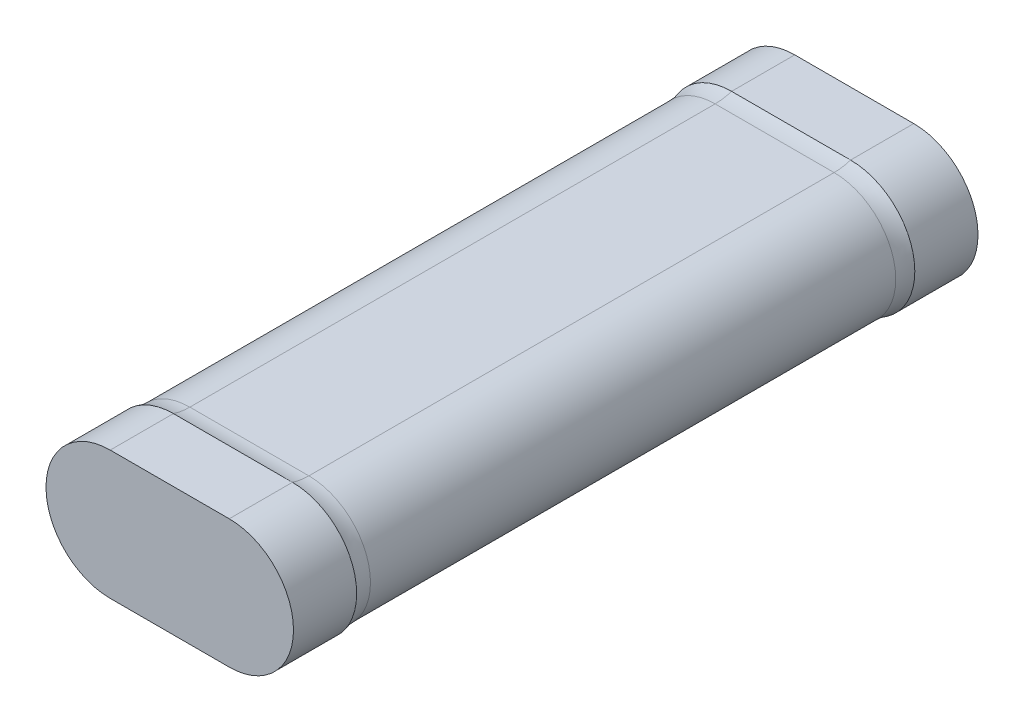
ISO-10303-21;
HEADER;
FILE_DESCRIPTION(('STEP AP214'),'2;1');
FILE_NAME('part.step','',(''),(''),'','','');
FILE_SCHEMA(('AUTOMOTIVE_DESIGN { 1 0 10303 214 1 1 1 1 }'));
ENDSEC;
DATA;
#1=APPLICATION_CONTEXT('core data for automotive mechanical design processes');
#2=APPLICATION_PROTOCOL_DEFINITION('international standard','automotive_design',2000,#1);
#3=PRODUCT_CONTEXT('',#1,'mechanical');
#4=PRODUCT('Part','Part','',(#3));
#5=PRODUCT_RELATED_PRODUCT_CATEGORY('part','',(#4));
#6=PRODUCT_DEFINITION_FORMATION('','',#4);
#7=PRODUCT_DEFINITION_CONTEXT('part definition',#1,'design');
#8=PRODUCT_DEFINITION('design','',#6,#7);
#9=PRODUCT_DEFINITION_SHAPE('','',#8);
#10=(LENGTH_UNIT() NAMED_UNIT(*) SI_UNIT(.MILLI.,.METRE.));
#11=(NAMED_UNIT(*) PLANE_ANGLE_UNIT() SI_UNIT($,.RADIAN.));
#12=(NAMED_UNIT(*) SI_UNIT($,.STERADIAN.) SOLID_ANGLE_UNIT());
#13=UNCERTAINTY_MEASURE_WITH_UNIT(LENGTH_MEASURE(1.E-05),#10,'distance_accuracy_value','');
#14=(GEOMETRIC_REPRESENTATION_CONTEXT(3) GLOBAL_UNCERTAINTY_ASSIGNED_CONTEXT((#13)) GLOBAL_UNIT_ASSIGNED_CONTEXT((#10,
#11,#12)) REPRESENTATION_CONTEXT('',''));
#15=CARTESIAN_POINT('',(0.,0.,0.));
#16=DIRECTION('',(0.,0.,1.));
#17=DIRECTION('',(1.,0.,0.));
#18=AXIS2_PLACEMENT_3D('',#15,#16,#17);
#19=CARTESIAN_POINT('',(-11.3,0.,-65.));
#20=DIRECTION('',(0.,0.,1.));
#21=DIRECTION('',(1.,0.,0.));
#22=AXIS2_PLACEMENT_3D('',#19,#20,#21);
#23=CYLINDRICAL_SURFACE('',#22,11.7);
#24=DIRECTION('',(0.,0.,1.));
#25=VECTOR('',#24,1.);
#26=CARTESIAN_POINT('',(-11.3,11.7,-65.));
#27=LINE('',#26,#25);
#28=CARTESIAN_POINT('',(-11.3,11.7,-49.8775010008007));
#29=VERTEX_POINT('',#28);
#30=CARTESIAN_POINT('',(-11.3,11.7,49.8775010008007));
#31=VERTEX_POINT('',#30);
#32=EDGE_CURVE('E208',#29,#31,#27,.T.);
#33=ORIENTED_EDGE('',*,*,#32,.F.);
#34=CARTESIAN_POINT('',(-11.3,0.,-49.8775010008007));
#35=DIRECTION('',(0.,0.,-1.));
#36=DIRECTION('',(-1.,0.,0.));
#37=AXIS2_PLACEMENT_3D('',#34,#35,#36);
#38=CIRCLE('',#37,11.7);
#39=CARTESIAN_POINT('',(-11.3,-11.7,-49.8775010008007));
#40=VERTEX_POINT('',#39);
#41=EDGE_CURVE('E43',#29,#40,#38,.F.);
#42=ORIENTED_EDGE('',*,*,#41,.T.);
#43=DIRECTION('',(0.,0.,1.));
#44=VECTOR('',#43,1.);
#45=CARTESIAN_POINT('',(-11.3,-11.7,-65.));
#46=LINE('',#45,#44);
#47=CARTESIAN_POINT('',(-11.3,-11.7,49.8775010008007));
#48=VERTEX_POINT('',#47);
#49=EDGE_CURVE('E202',#40,#48,#46,.T.);
#50=ORIENTED_EDGE('',*,*,#49,.T.);
#51=CARTESIAN_POINT('',(-11.3,0.,49.8775010008007));
#52=DIRECTION('',(0.,0.,1.));
#53=DIRECTION('',(1.,0.,0.));
#54=AXIS2_PLACEMENT_3D('',#51,#52,#53);
#55=CIRCLE('',#54,11.7);
#56=EDGE_CURVE('E224',#48,#31,#55,.F.);
#57=ORIENTED_EDGE('',*,*,#56,.T.);
#58=EDGE_LOOP('',(#33,#42,#50,#57));
#59=FACE_BOUND('',#58,.T.);
#60=ADVANCED_FACE('F34',(#59),#23,.T.);
#61=CARTESIAN_POINT('',(-11.3,11.7,-65.));
#62=DIRECTION('',(0.,1.,0.));
#63=DIRECTION('',(0.,0.,1.));
#64=AXIS2_PLACEMENT_3D('',#61,#62,#63);
#65=PLANE('',#64);
#66=DIRECTION('',(0.,0.,1.));
#67=VECTOR('',#66,1.);
#68=CARTESIAN_POINT('',(11.3,11.7,-65.));
#69=LINE('',#68,#67);
#70=CARTESIAN_POINT('',(11.3,11.7,-49.8775010008007));
#71=VERTEX_POINT('',#70);
#72=CARTESIAN_POINT('',(11.3,11.7,49.8775010008007));
#73=VERTEX_POINT('',#72);
#74=EDGE_CURVE('E211',#71,#73,#69,.T.);
#75=ORIENTED_EDGE('',*,*,#74,.F.);
#76=DIRECTION('',(1.,0.,0.));
#77=VECTOR('',#76,1.);
#78=CARTESIAN_POINT('',(-11.3,11.7,-49.8775010008007));
#79=LINE('',#78,#77);
#80=EDGE_CURVE('E11',#71,#29,#79,.F.);
#81=ORIENTED_EDGE('',*,*,#80,.T.);
#82=ORIENTED_EDGE('',*,*,#32,.T.);
#83=DIRECTION('',(1.,0.,0.));
#84=VECTOR('',#83,1.);
#85=CARTESIAN_POINT('',(11.3,11.7,49.8775010008007));
#86=LINE('',#85,#84);
#87=EDGE_CURVE('E221',#31,#73,#86,.T.);
#88=ORIENTED_EDGE('',*,*,#87,.T.);
#89=EDGE_LOOP('',(#75,#81,#82,#88));
#90=FACE_BOUND('',#89,.T.);
#91=ADVANCED_FACE('F274',(#90),#65,.T.);
#92=CARTESIAN_POINT('',(11.3,0.,-65.));
#93=DIRECTION('',(0.,0.,1.));
#94=DIRECTION('',(1.,0.,0.));
#95=AXIS2_PLACEMENT_3D('',#92,#93,#94);
#96=CYLINDRICAL_SURFACE('',#95,11.7);
#97=DIRECTION('',(0.,0.,1.));
#98=VECTOR('',#97,1.);
#99=CARTESIAN_POINT('',(11.3,-11.7,-65.));
#100=LINE('',#99,#98);
#101=CARTESIAN_POINT('',(11.3,-11.7,-49.8775010008007));
#102=VERTEX_POINT('',#101);
#103=CARTESIAN_POINT('',(11.3,-11.7,49.8775010008007));
#104=VERTEX_POINT('',#103);
#105=EDGE_CURVE('E213',#102,#104,#100,.T.);
#106=ORIENTED_EDGE('',*,*,#105,.F.);
#107=CARTESIAN_POINT('',(11.3,0.,-49.8775010008007));
#108=DIRECTION('',(0.,0.,-1.));
#109=DIRECTION('',(-1.,0.,0.));
#110=AXIS2_PLACEMENT_3D('',#107,#108,#109);
#111=CIRCLE('',#110,11.7);
#112=EDGE_CURVE('E227',#102,#71,#111,.F.);
#113=ORIENTED_EDGE('',*,*,#112,.T.);
#114=ORIENTED_EDGE('',*,*,#74,.T.);
#115=CARTESIAN_POINT('',(11.3,0.,49.8775010008007));
#116=DIRECTION('',(0.,0.,1.));
#117=DIRECTION('',(1.,0.,0.));
#118=AXIS2_PLACEMENT_3D('',#115,#116,#117);
#119=CIRCLE('',#118,11.7);
#120=EDGE_CURVE('E218',#73,#104,#119,.F.);
#121=ORIENTED_EDGE('',*,*,#120,.T.);
#122=EDGE_LOOP('',(#106,#113,#114,#121));
#123=FACE_BOUND('',#122,.T.);
#124=ADVANCED_FACE('F279',(#123),#96,.T.);
#125=CARTESIAN_POINT('',(-11.3,-11.7,-65.));
#126=DIRECTION('',(0.,-1.,0.));
#127=DIRECTION('',(0.,0.,-1.));
#128=AXIS2_PLACEMENT_3D('',#125,#126,#127);
#129=PLANE('',#128);
#130=ORIENTED_EDGE('',*,*,#49,.F.);
#131=DIRECTION('',(-1.,0.,0.));
#132=VECTOR('',#131,1.);
#133=CARTESIAN_POINT('',(11.3,-11.7,-49.8775010008007));
#134=LINE('',#133,#132);
#135=EDGE_CURVE('E240',#40,#102,#134,.F.);
#136=ORIENTED_EDGE('',*,*,#135,.T.);
#137=ORIENTED_EDGE('',*,*,#105,.T.);
#138=DIRECTION('',(-1.,0.,0.));
#139=VECTOR('',#138,1.);
#140=CARTESIAN_POINT('',(-11.3,-11.7,49.8775010008007));
#141=LINE('',#140,#139);
#142=EDGE_CURVE('E210',#104,#48,#141,.T.);
#143=ORIENTED_EDGE('',*,*,#142,.T.);
#144=EDGE_LOOP('',(#130,#136,#137,#143));
#145=FACE_BOUND('',#144,.T.);
#146=ADVANCED_FACE('F282',(#145),#129,.T.);
#147=CARTESIAN_POINT('',(-11.3,0.,53.));
#148=DIRECTION('',(0.,0.,1.));
#149=DIRECTION('',(1.,0.,0.));
#150=AXIS2_PLACEMENT_3D('',#147,#148,#149);
#151=CYLINDRICAL_SURFACE('',#150,12.2);
#152=CARTESIAN_POINT('',(-11.3,0.,65.));
#153=DIRECTION('',(0.,0.,1.));
#154=DIRECTION('',(1.,0.,0.));
#155=AXIS2_PLACEMENT_3D('',#152,#153,#154);
#156=CIRCLE('',#155,12.2);
#157=CARTESIAN_POINT('',(-11.3,12.2,65.));
#158=VERTEX_POINT('',#157);
#159=CARTESIAN_POINT('',(-11.3,-12.2,65.));
#160=VERTEX_POINT('',#159);
#161=EDGE_CURVE('E171',#158,#160,#156,.T.);
#162=ORIENTED_EDGE('',*,*,#161,.F.);
#163=DIRECTION('',(0.,0.,1.));
#164=VECTOR('',#163,1.);
#165=CARTESIAN_POINT('',(-11.3,12.2,53.));
#166=LINE('',#165,#164);
#167=CARTESIAN_POINT('',(-11.3,12.2,53.));
#168=VERTEX_POINT('',#167);
#169=EDGE_CURVE('E200',#168,#158,#166,.T.);
#170=ORIENTED_EDGE('',*,*,#169,.F.);
#171=CARTESIAN_POINT('',(-11.3,0.,53.));
#172=DIRECTION('',(0.,0.,1.));
#173=DIRECTION('',(1.,0.,0.));
#174=AXIS2_PLACEMENT_3D('',#171,#172,#173);
#175=CIRCLE('',#174,12.2);
#176=CARTESIAN_POINT('',(-11.3,-12.2,53.));
#177=VERTEX_POINT('',#176);
#178=EDGE_CURVE('E176',#168,#177,#175,.T.);
#179=ORIENTED_EDGE('',*,*,#178,.T.);
#180=DIRECTION('',(0.,0.,1.));
#181=VECTOR('',#180,1.);
#182=CARTESIAN_POINT('',(-11.3,-12.2,53.));
#183=LINE('',#182,#181);
#184=EDGE_CURVE('E189',#177,#160,#183,.T.);
#185=ORIENTED_EDGE('',*,*,#184,.T.);
#186=EDGE_LOOP('',(#162,#170,#179,#185));
#187=FACE_BOUND('',#186,.T.);
#188=ADVANCED_FACE('F355',(#187),#151,.T.);
#189=CARTESIAN_POINT('',(-11.3,12.2,53.));
#190=DIRECTION('',(0.,1.,0.));
#191=DIRECTION('',(0.,0.,1.));
#192=AXIS2_PLACEMENT_3D('',#189,#190,#191);
#193=PLANE('',#192);
#194=DIRECTION('',(-1.,0.,0.));
#195=VECTOR('',#194,1.);
#196=CARTESIAN_POINT('',(-11.3,12.2,65.));
#197=LINE('',#196,#195);
#198=CARTESIAN_POINT('',(11.3,12.2,65.));
#199=VERTEX_POINT('',#198);
#200=EDGE_CURVE('E180',#199,#158,#197,.T.);
#201=ORIENTED_EDGE('',*,*,#200,.F.);
#202=DIRECTION('',(0.,0.,1.));
#203=VECTOR('',#202,1.);
#204=CARTESIAN_POINT('',(11.3,12.2,53.));
#205=LINE('',#204,#203);
#206=CARTESIAN_POINT('',(11.3,12.2,53.));
#207=VERTEX_POINT('',#206);
#208=EDGE_CURVE('E203',#207,#199,#205,.T.);
#209=ORIENTED_EDGE('',*,*,#208,.F.);
#210=DIRECTION('',(-1.,0.,0.));
#211=VECTOR('',#210,1.);
#212=CARTESIAN_POINT('',(-11.3,12.2,53.));
#213=LINE('',#212,#211);
#214=EDGE_CURVE('E186',#207,#168,#213,.T.);
#215=ORIENTED_EDGE('',*,*,#214,.T.);
#216=ORIENTED_EDGE('',*,*,#169,.T.);
#217=EDGE_LOOP('',(#201,#209,#215,#216));
#218=FACE_BOUND('',#217,.T.);
#219=ADVANCED_FACE('F345',(#218),#193,.T.);
#220=CARTESIAN_POINT('',(11.3,0.,53.));
#221=DIRECTION('',(0.,0.,1.));
#222=DIRECTION('',(1.,0.,0.));
#223=AXIS2_PLACEMENT_3D('',#220,#221,#222);
#224=CYLINDRICAL_SURFACE('',#223,12.2);
#225=CARTESIAN_POINT('',(11.3,0.,65.));
#226=DIRECTION('',(0.,0.,1.));
#227=DIRECTION('',(1.,0.,0.));
#228=AXIS2_PLACEMENT_3D('',#225,#226,#227);
#229=CIRCLE('',#228,12.2);
#230=CARTESIAN_POINT('',(11.3,-12.2,65.));
#231=VERTEX_POINT('',#230);
#232=EDGE_CURVE('E195',#231,#199,#229,.T.);
#233=ORIENTED_EDGE('',*,*,#232,.F.);
#234=DIRECTION('',(0.,0.,1.));
#235=VECTOR('',#234,1.);
#236=CARTESIAN_POINT('',(11.3,-12.2,53.));
#237=LINE('',#236,#235);
#238=CARTESIAN_POINT('',(11.3,-12.2,53.));
#239=VERTEX_POINT('',#238);
#240=EDGE_CURVE('E205',#239,#231,#237,.T.);
#241=ORIENTED_EDGE('',*,*,#240,.F.);
#242=CARTESIAN_POINT('',(11.3,0.,53.));
#243=DIRECTION('',(0.,0.,1.));
#244=DIRECTION('',(1.,0.,0.));
#245=AXIS2_PLACEMENT_3D('',#242,#243,#244);
#246=CIRCLE('',#245,12.2);
#247=EDGE_CURVE('E183',#239,#207,#246,.T.);
#248=ORIENTED_EDGE('',*,*,#247,.T.);
#249=ORIENTED_EDGE('',*,*,#208,.T.);
#250=EDGE_LOOP('',(#233,#241,#248,#249));
#251=FACE_BOUND('',#250,.T.);
#252=ADVANCED_FACE('F333',(#251),#224,.T.);
#253=CARTESIAN_POINT('',(-11.3,-12.2,53.));
#254=DIRECTION('',(0.,-1.,0.));
#255=DIRECTION('',(0.,0.,-1.));
#256=AXIS2_PLACEMENT_3D('',#253,#254,#255);
#257=PLANE('',#256);
#258=DIRECTION('',(1.,0.,0.));
#259=VECTOR('',#258,1.);
#260=CARTESIAN_POINT('',(-11.3,-12.2,65.));
#261=LINE('',#260,#259);
#262=EDGE_CURVE('E192',#160,#231,#261,.T.);
#263=ORIENTED_EDGE('',*,*,#262,.F.);
#264=ORIENTED_EDGE('',*,*,#184,.F.);
#265=DIRECTION('',(1.,0.,0.));
#266=VECTOR('',#265,1.);
#267=CARTESIAN_POINT('',(-11.3,-12.2,53.));
#268=LINE('',#267,#266);
#269=EDGE_CURVE('E179',#177,#239,#268,.T.);
#270=ORIENTED_EDGE('',*,*,#269,.T.);
#271=ORIENTED_EDGE('',*,*,#240,.T.);
#272=EDGE_LOOP('',(#263,#264,#270,#271));
#273=FACE_BOUND('',#272,.T.);
#274=ADVANCED_FACE('F327',(#273),#257,.T.);
#275=CARTESIAN_POINT('',(-11.3,0.,65.));
#276=DIRECTION('',(0.,0.,1.));
#277=DIRECTION('',(1.,0.,0.));
#278=AXIS2_PLACEMENT_3D('',#275,#276,#277);
#279=PLANE('',#278);
#280=ORIENTED_EDGE('',*,*,#161,.T.);
#281=ORIENTED_EDGE('',*,*,#262,.T.);
#282=ORIENTED_EDGE('',*,*,#232,.T.);
#283=ORIENTED_EDGE('',*,*,#200,.T.);
#284=EDGE_LOOP('',(#280,#281,#282,#283));
#285=FACE_BOUND('',#284,.T.);
#286=ADVANCED_FACE('F332',(#285),#279,.T.);
#287=CARTESIAN_POINT('',(-11.3,0.,-53.));
#288=DIRECTION('',(0.,0.,-1.));
#289=DIRECTION('',(-1.,0.,0.));
#290=AXIS2_PLACEMENT_3D('',#287,#288,#289);
#291=CYLINDRICAL_SURFACE('',#290,12.2);
#292=CARTESIAN_POINT('',(-11.3,0.,-65.));
#293=DIRECTION('',(0.,0.,1.));
#294=DIRECTION('',(1.,0.,0.));
#295=AXIS2_PLACEMENT_3D('',#292,#293,#294);
#296=CIRCLE('',#295,12.2);
#297=CARTESIAN_POINT('',(-11.3,12.2,-65.));
#298=VERTEX_POINT('',#297);
#299=CARTESIAN_POINT('',(-11.3,-12.2,-65.));
#300=VERTEX_POINT('',#299);
#301=EDGE_CURVE('E163',#298,#300,#296,.T.);
#302=ORIENTED_EDGE('',*,*,#301,.T.);
#303=DIRECTION('',(0.,0.,-1.));
#304=VECTOR('',#303,1.);
#305=CARTESIAN_POINT('',(-11.3,-12.2,-53.));
#306=LINE('',#305,#304);
#307=CARTESIAN_POINT('',(-11.3,-12.2,-53.));
#308=VERTEX_POINT('',#307);
#309=EDGE_CURVE('E144',#308,#300,#306,.T.);
#310=ORIENTED_EDGE('',*,*,#309,.F.);
#311=CARTESIAN_POINT('',(-11.3,0.,-53.));
#312=DIRECTION('',(0.,0.,1.));
#313=DIRECTION('',(1.,0.,0.));
#314=AXIS2_PLACEMENT_3D('',#311,#312,#313);
#315=CIRCLE('',#314,12.2);
#316=CARTESIAN_POINT('',(-11.3,12.2,-53.));
#317=VERTEX_POINT('',#316);
#318=EDGE_CURVE('E140',#317,#308,#315,.T.);
#319=ORIENTED_EDGE('',*,*,#318,.F.);
#320=DIRECTION('',(0.,0.,-1.));
#321=VECTOR('',#320,1.);
#322=CARTESIAN_POINT('',(-11.3,12.2,-53.));
#323=LINE('',#322,#321);
#324=EDGE_CURVE('E123',#317,#298,#323,.T.);
#325=ORIENTED_EDGE('',*,*,#324,.T.);
#326=EDGE_LOOP('',(#302,#310,#319,#325));
#327=FACE_BOUND('',#326,.T.);
#328=ADVANCED_FACE('F142',(#327),#291,.T.);
#329=CARTESIAN_POINT('',(-11.3,-12.2,-53.));
#330=DIRECTION('',(0.,1.,0.));
#331=DIRECTION('',(0.,0.,1.));
#332=AXIS2_PLACEMENT_3D('',#329,#330,#331);
#333=PLANE('',#332);
#334=DIRECTION('',(1.,0.,0.));
#335=VECTOR('',#334,1.);
#336=CARTESIAN_POINT('',(-11.3,-12.2,-65.));
#337=LINE('',#336,#335);
#338=CARTESIAN_POINT('',(11.3,-12.2,-65.));
#339=VERTEX_POINT('',#338);
#340=EDGE_CURVE('E148',#300,#339,#337,.T.);
#341=ORIENTED_EDGE('',*,*,#340,.T.);
#342=DIRECTION('',(0.,0.,-1.));
#343=VECTOR('',#342,1.);
#344=CARTESIAN_POINT('',(11.3,-12.2,-53.));
#345=LINE('',#344,#343);
#346=CARTESIAN_POINT('',(11.3,-12.2,-53.));
#347=VERTEX_POINT('',#346);
#348=EDGE_CURVE('E172',#347,#339,#345,.T.);
#349=ORIENTED_EDGE('',*,*,#348,.F.);
#350=DIRECTION('',(1.,0.,0.));
#351=VECTOR('',#350,1.);
#352=CARTESIAN_POINT('',(-11.3,-12.2,-53.));
#353=LINE('',#352,#351);
#354=EDGE_CURVE('E136',#308,#347,#353,.T.);
#355=ORIENTED_EDGE('',*,*,#354,.F.);
#356=ORIENTED_EDGE('',*,*,#309,.T.);
#357=EDGE_LOOP('',(#341,#349,#355,#356));
#358=FACE_BOUND('',#357,.T.);
#359=ADVANCED_FACE('F254',(#358),#333,.F.);
#360=CARTESIAN_POINT('',(11.3,0.,-53.));
#361=DIRECTION('',(0.,0.,-1.));
#362=DIRECTION('',(-1.,0.,0.));
#363=AXIS2_PLACEMENT_3D('',#360,#361,#362);
#364=CYLINDRICAL_SURFACE('',#363,12.2);
#365=CARTESIAN_POINT('',(11.3,0.,-65.));
#366=DIRECTION('',(0.,0.,1.));
#367=DIRECTION('',(1.,0.,0.));
#368=AXIS2_PLACEMENT_3D('',#365,#366,#367);
#369=CIRCLE('',#368,12.2);
#370=CARTESIAN_POINT('',(11.3,12.2,-65.));
#371=VERTEX_POINT('',#370);
#372=EDGE_CURVE('E167',#339,#371,#369,.T.);
#373=ORIENTED_EDGE('',*,*,#372,.T.);
#374=DIRECTION('',(0.,0.,-1.));
#375=VECTOR('',#374,1.);
#376=CARTESIAN_POINT('',(11.3,12.2,-53.));
#377=LINE('',#376,#375);
#378=CARTESIAN_POINT('',(11.3,12.2,-53.));
#379=VERTEX_POINT('',#378);
#380=EDGE_CURVE('E135',#379,#371,#377,.T.);
#381=ORIENTED_EDGE('',*,*,#380,.F.);
#382=CARTESIAN_POINT('',(11.3,0.,-53.));
#383=DIRECTION('',(0.,0.,1.));
#384=DIRECTION('',(1.,0.,0.));
#385=AXIS2_PLACEMENT_3D('',#382,#383,#384);
#386=CIRCLE('',#385,12.2);
#387=EDGE_CURVE('E157',#347,#379,#386,.T.);
#388=ORIENTED_EDGE('',*,*,#387,.F.);
#389=ORIENTED_EDGE('',*,*,#348,.T.);
#390=EDGE_LOOP('',(#373,#381,#388,#389));
#391=FACE_BOUND('',#390,.T.);
#392=ADVANCED_FACE('F257',(#391),#364,.T.);
#393=CARTESIAN_POINT('',(-11.3,12.2,-53.));
#394=DIRECTION('',(0.,-1.,0.));
#395=DIRECTION('',(0.,0.,-1.));
#396=AXIS2_PLACEMENT_3D('',#393,#394,#395);
#397=PLANE('',#396);
#398=DIRECTION('',(-1.,0.,0.));
#399=VECTOR('',#398,1.);
#400=CARTESIAN_POINT('',(-11.3,12.2,-65.));
#401=LINE('',#400,#399);
#402=EDGE_CURVE('E131',#371,#298,#401,.T.);
#403=ORIENTED_EDGE('',*,*,#402,.T.);
#404=ORIENTED_EDGE('',*,*,#324,.F.);
#405=DIRECTION('',(-1.,0.,0.));
#406=VECTOR('',#405,1.);
#407=CARTESIAN_POINT('',(-11.3,12.2,-53.));
#408=LINE('',#407,#406);
#409=EDGE_CURVE('E128',#379,#317,#408,.T.);
#410=ORIENTED_EDGE('',*,*,#409,.F.);
#411=ORIENTED_EDGE('',*,*,#380,.T.);
#412=EDGE_LOOP('',(#403,#404,#410,#411));
#413=FACE_BOUND('',#412,.T.);
#414=ADVANCED_FACE('F125',(#413),#397,.F.);
#415=CARTESIAN_POINT('',(-11.3,0.,-65.));
#416=DIRECTION('',(0.,0.,1.));
#417=DIRECTION('',(1.,0.,0.));
#418=AXIS2_PLACEMENT_3D('',#415,#416,#417);
#419=PLANE('',#418);
#420=ORIENTED_EDGE('',*,*,#301,.F.);
#421=ORIENTED_EDGE('',*,*,#402,.F.);
#422=ORIENTED_EDGE('',*,*,#372,.F.);
#423=ORIENTED_EDGE('',*,*,#340,.F.);
#424=EDGE_LOOP('',(#420,#421,#422,#423));
#425=FACE_BOUND('',#424,.T.);
#426=ADVANCED_FACE('F259',(#425),#419,.F.);
#427=CARTESIAN_POINT('',(-11.3,21.7,49.8775010008007));
#428=DIRECTION('',(-1.,0.,0.));
#429=DIRECTION('',(0.,0.,1.));
#430=AXIS2_PLACEMENT_3D('',#427,#428,#429);
#431=CYLINDRICAL_SURFACE('',#430,10.);
#432=CARTESIAN_POINT('',(-11.3,21.7,49.8775010008007));
#433=DIRECTION('',(1.,0.,0.));
#434=DIRECTION('',(0.,0.,-1.));
#435=AXIS2_PLACEMENT_3D('',#432,#433,#434);
#436=CIRCLE('',#435,10.);
#437=EDGE_CURVE('E233',#168,#31,#436,.T.);
#438=ORIENTED_EDGE('',*,*,#437,.F.);
#439=ORIENTED_EDGE('',*,*,#214,.F.);
#440=CARTESIAN_POINT('',(11.3,21.7,49.8775010008007));
#441=DIRECTION('',(-1.,0.,0.));
#442=DIRECTION('',(0.,0.,1.));
#443=AXIS2_PLACEMENT_3D('',#440,#441,#442);
#444=CIRCLE('',#443,10.);
#445=EDGE_CURVE('E165',#73,#207,#444,.T.);
#446=ORIENTED_EDGE('',*,*,#445,.F.);
#447=ORIENTED_EDGE('',*,*,#87,.F.);
#448=EDGE_LOOP('',(#438,#439,#446,#447));
#449=FACE_BOUND('',#448,.T.);
#450=ADVANCED_FACE('F261',(#449),#431,.F.);
#451=CARTESIAN_POINT('',(11.3,0.,49.8775010008007));
#452=DIRECTION('',(0.,0.,1.));
#453=DIRECTION('',(1.,0.,0.));
#454=AXIS2_PLACEMENT_3D('',#451,#452,#453);
#455=TOROIDAL_SURFACE('',#454,21.7,10.);
#456=ORIENTED_EDGE('',*,*,#445,.T.);
#457=ORIENTED_EDGE('',*,*,#247,.F.);
#458=CARTESIAN_POINT('',(11.3,-21.7,49.8775010008007));
#459=DIRECTION('',(1.,0.,0.));
#460=DIRECTION('',(0.,1.,0.));
#461=AXIS2_PLACEMENT_3D('',#458,#459,#460);
#462=CIRCLE('',#461,10.);
#463=EDGE_CURVE('E231',#104,#239,#462,.T.);
#464=ORIENTED_EDGE('',*,*,#463,.F.);
#465=ORIENTED_EDGE('',*,*,#120,.F.);
#466=EDGE_LOOP('',(#456,#457,#464,#465));
#467=FACE_BOUND('',#466,.T.);
#468=ADVANCED_FACE('F267',(#467),#455,.F.);
#469=CARTESIAN_POINT('',(-11.3,0.,49.8775010008007));
#470=DIRECTION('',(0.,0.,1.));
#471=DIRECTION('',(1.,0.,0.));
#472=AXIS2_PLACEMENT_3D('',#469,#470,#471);
#473=TOROIDAL_SURFACE('',#472,21.7,10.);
#474=ORIENTED_EDGE('',*,*,#437,.T.);
#475=ORIENTED_EDGE('',*,*,#56,.F.);
#476=CARTESIAN_POINT('',(-11.3,-21.7,49.8775010008007));
#477=DIRECTION('',(-1.,0.,0.));
#478=DIRECTION('',(0.,0.,1.));
#479=AXIS2_PLACEMENT_3D('',#476,#477,#478);
#480=CIRCLE('',#479,10.);
#481=EDGE_CURVE('E228',#177,#48,#480,.T.);
#482=ORIENTED_EDGE('',*,*,#481,.F.);
#483=ORIENTED_EDGE('',*,*,#178,.F.);
#484=EDGE_LOOP('',(#474,#475,#482,#483));
#485=FACE_BOUND('',#484,.T.);
#486=ADVANCED_FACE('F287',(#485),#473,.F.);
#487=CARTESIAN_POINT('',(-11.3,-21.7,49.8775010008007));
#488=DIRECTION('',(1.,0.,0.));
#489=DIRECTION('',(0.,0.,-1.));
#490=AXIS2_PLACEMENT_3D('',#487,#488,#489);
#491=CYLINDRICAL_SURFACE('',#490,10.);
#492=ORIENTED_EDGE('',*,*,#463,.T.);
#493=ORIENTED_EDGE('',*,*,#269,.F.);
#494=ORIENTED_EDGE('',*,*,#481,.T.);
#495=ORIENTED_EDGE('',*,*,#142,.F.);
#496=EDGE_LOOP('',(#492,#493,#494,#495));
#497=FACE_BOUND('',#496,.T.);
#498=ADVANCED_FACE('F284',(#497),#491,.F.);
#499=CARTESIAN_POINT('',(-11.3,0.,-49.8775010008007));
#500=DIRECTION('',(0.,0.,-1.));
#501=DIRECTION('',(-1.,0.,0.));
#502=AXIS2_PLACEMENT_3D('',#499,#500,#501);
#503=TOROIDAL_SURFACE('',#502,21.7,10.);
#504=CARTESIAN_POINT('',(-11.3,21.7,-49.8775010008008));
#505=DIRECTION('',(-1.,0.,0.));
#506=DIRECTION('',(0.,0.,1.));
#507=AXIS2_PLACEMENT_3D('',#504,#505,#506);
#508=CIRCLE('',#507,10.);
#509=EDGE_CURVE('E151',#317,#29,#508,.T.);
#510=ORIENTED_EDGE('',*,*,#509,.F.);
#511=ORIENTED_EDGE('',*,*,#318,.T.);
#512=CARTESIAN_POINT('',(-11.3,-21.7,-49.8775010008007));
#513=DIRECTION('',(-1.,0.,0.));
#514=DIRECTION('',(0.,0.,1.));
#515=AXIS2_PLACEMENT_3D('',#512,#513,#514);
#516=CIRCLE('',#515,10.);
#517=EDGE_CURVE('E38',#40,#308,#516,.T.);
#518=ORIENTED_EDGE('',*,*,#517,.F.);
#519=ORIENTED_EDGE('',*,*,#41,.F.);
#520=EDGE_LOOP('',(#510,#511,#518,#519));
#521=FACE_BOUND('',#520,.T.);
#522=ADVANCED_FACE('F36',(#521),#503,.F.);
#523=CARTESIAN_POINT('',(-11.3,-21.7,-49.8775010008007));
#524=DIRECTION('',(1.,0.,0.));
#525=DIRECTION('',(0.,0.,-1.));
#526=AXIS2_PLACEMENT_3D('',#523,#524,#525);
#527=CYLINDRICAL_SURFACE('',#526,10.);
#528=ORIENTED_EDGE('',*,*,#517,.T.);
#529=ORIENTED_EDGE('',*,*,#354,.T.);
#530=CARTESIAN_POINT('',(11.3,-21.7,-49.8775010008007));
#531=DIRECTION('',(-1.,0.,0.));
#532=DIRECTION('',(0.,0.,1.));
#533=AXIS2_PLACEMENT_3D('',#530,#531,#532);
#534=CIRCLE('',#533,10.);
#535=EDGE_CURVE('E153',#102,#347,#534,.T.);
#536=ORIENTED_EDGE('',*,*,#535,.F.);
#537=ORIENTED_EDGE('',*,*,#135,.F.);
#538=EDGE_LOOP('',(#528,#529,#536,#537));
#539=FACE_BOUND('',#538,.T.);
#540=ADVANCED_FACE('F252',(#539),#527,.F.);
#541=CARTESIAN_POINT('',(-11.3,21.7,-49.8775010008007));
#542=DIRECTION('',(-1.,0.,0.));
#543=DIRECTION('',(0.,0.,1.));
#544=AXIS2_PLACEMENT_3D('',#541,#542,#543);
#545=CYLINDRICAL_SURFACE('',#544,10.);
#546=ORIENTED_EDGE('',*,*,#509,.T.);
#547=ORIENTED_EDGE('',*,*,#80,.F.);
#548=CARTESIAN_POINT('',(11.3,21.7,-49.8775010008007));
#549=DIRECTION('',(-1.,0.,0.));
#550=DIRECTION('',(0.,0.,1.));
#551=AXIS2_PLACEMENT_3D('',#548,#549,#550);
#552=CIRCLE('',#551,10.);
#553=EDGE_CURVE('E156',#379,#71,#552,.T.);
#554=ORIENTED_EDGE('',*,*,#553,.F.);
#555=ORIENTED_EDGE('',*,*,#409,.T.);
#556=EDGE_LOOP('',(#546,#547,#554,#555));
#557=FACE_BOUND('',#556,.T.);
#558=ADVANCED_FACE('F155',(#557),#545,.F.);
#559=CARTESIAN_POINT('',(11.3,0.,-49.8775010008007));
#560=DIRECTION('',(0.,0.,-1.));
#561=DIRECTION('',(-1.,0.,0.));
#562=AXIS2_PLACEMENT_3D('',#559,#560,#561);
#563=TOROIDAL_SURFACE('',#562,21.7,10.);
#564=ORIENTED_EDGE('',*,*,#535,.T.);
#565=ORIENTED_EDGE('',*,*,#387,.T.);
#566=ORIENTED_EDGE('',*,*,#553,.T.);
#567=ORIENTED_EDGE('',*,*,#112,.F.);
#568=EDGE_LOOP('',(#564,#565,#566,#567));
#569=FACE_BOUND('',#568,.T.);
#570=ADVANCED_FACE('F247',(#569),#563,.F.);
#571=CLOSED_SHELL('',(#60,#91,#124,#146,#188,#219,#252,#274,#286,#328,#359,#392,#414,#426,#450,
#468,#486,#498,#522,#540,#558,#570));
#572=MANIFOLD_SOLID_BREP('B2',#571);
#573=ADVANCED_BREP_SHAPE_REPRESENTATION('',(#18,#572),#14);
#574=SHAPE_DEFINITION_REPRESENTATION(#9,#573);
ENDSEC;
END-ISO-10303-21;
